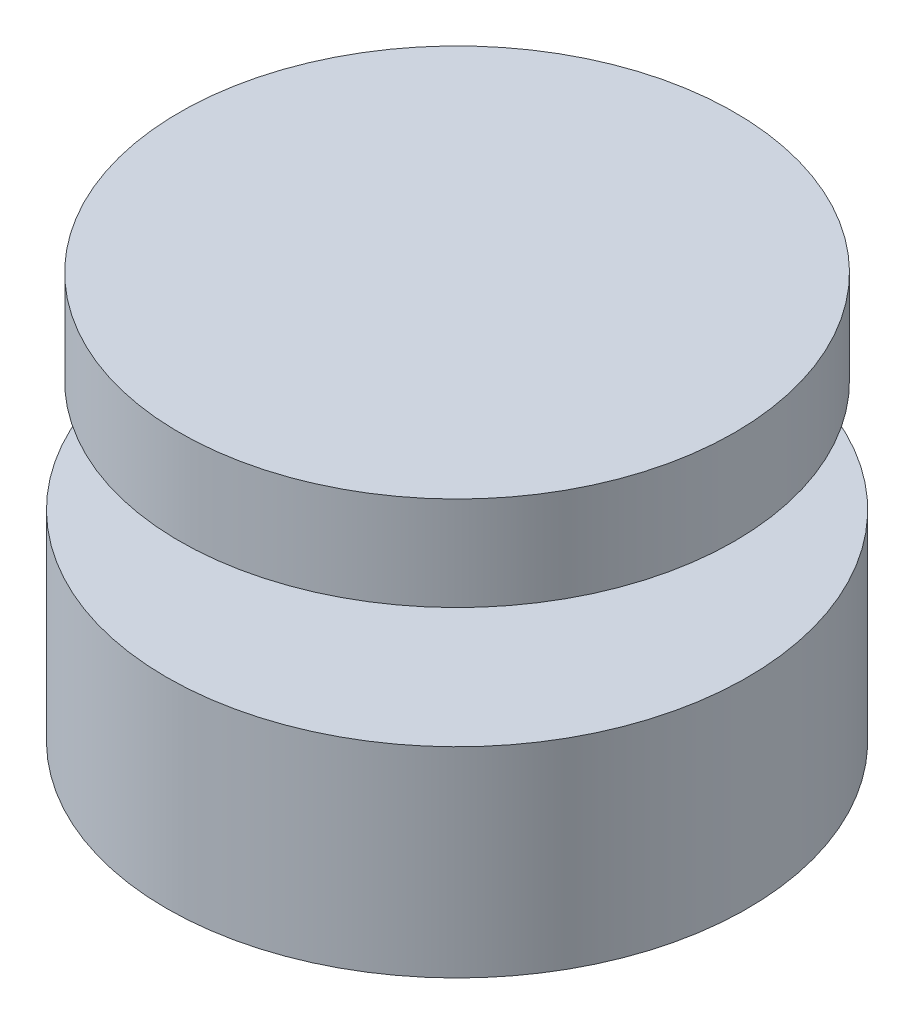
ISO-10303-21;
HEADER;
FILE_DESCRIPTION(('STEP AP214'),'2;1');
FILE_NAME('part.step','',(''),(''),'','','');
FILE_SCHEMA(('AUTOMOTIVE_DESIGN { 1 0 10303 214 1 1 1 1 }'));
ENDSEC;
DATA;
#1=APPLICATION_CONTEXT('core data for automotive mechanical design processes');
#2=APPLICATION_PROTOCOL_DEFINITION('international standard','automotive_design',2000,#1);
#3=PRODUCT_CONTEXT('',#1,'mechanical');
#4=PRODUCT('Part','Part','',(#3));
#5=PRODUCT_RELATED_PRODUCT_CATEGORY('part','',(#4));
#6=PRODUCT_DEFINITION_FORMATION('','',#4);
#7=PRODUCT_DEFINITION_CONTEXT('part definition',#1,'design');
#8=PRODUCT_DEFINITION('design','',#6,#7);
#9=PRODUCT_DEFINITION_SHAPE('','',#8);
#10=(LENGTH_UNIT() NAMED_UNIT(*) SI_UNIT(.MILLI.,.METRE.));
#11=(NAMED_UNIT(*) PLANE_ANGLE_UNIT() SI_UNIT($,.RADIAN.));
#12=(NAMED_UNIT(*) SI_UNIT($,.STERADIAN.) SOLID_ANGLE_UNIT());
#13=UNCERTAINTY_MEASURE_WITH_UNIT(LENGTH_MEASURE(1.E-05),#10,'distance_accuracy_value','');
#14=(GEOMETRIC_REPRESENTATION_CONTEXT(3) GLOBAL_UNCERTAINTY_ASSIGNED_CONTEXT((#13)) GLOBAL_UNIT_ASSIGNED_CONTEXT((#10,
#11,#12)) REPRESENTATION_CONTEXT('',''));
#15=CARTESIAN_POINT('',(0.,0.,0.));
#16=DIRECTION('',(0.,0.,1.));
#17=DIRECTION('',(1.,0.,0.));
#18=AXIS2_PLACEMENT_3D('',#15,#16,#17);
#19=CARTESIAN_POINT('',(0.,2.,0.));
#20=DIRECTION('',(0.,-1.,0.));
#21=DIRECTION('',(0.,0.,-1.));
#22=AXIS2_PLACEMENT_3D('',#19,#20,#21);
#23=CYLINDRICAL_SURFACE('',#22,2.9);
#24=CARTESIAN_POINT('',(0.,2.,0.));
#25=DIRECTION('',(0.,1.,0.));
#26=DIRECTION('',(0.,0.,1.));
#27=AXIS2_PLACEMENT_3D('',#24,#25,#26);
#28=CIRCLE('',#27,2.9);
#29=CARTESIAN_POINT('',(0.,2.,2.9));
#30=VERTEX_POINT('',#29);
#31=EDGE_CURVE('E10',#30,#30,#28,.T.);
#32=ORIENTED_EDGE('',*,*,#31,.F.);
#33=EDGE_LOOP('',(#32));
#34=FACE_BOUND('',#33,.T.);
#35=CARTESIAN_POINT('',(0.,0.,0.));
#36=DIRECTION('',(0.,1.,0.));
#37=DIRECTION('',(0.,0.,1.));
#38=AXIS2_PLACEMENT_3D('',#35,#36,#37);
#39=CIRCLE('',#38,2.9);
#40=CARTESIAN_POINT('',(0.,0.,2.9));
#41=VERTEX_POINT('',#40);
#42=EDGE_CURVE('E46',#41,#41,#39,.T.);
#43=ORIENTED_EDGE('',*,*,#42,.T.);
#44=EDGE_LOOP('',(#43));
#45=FACE_BOUND('',#44,.T.);
#46=ADVANCED_FACE('F43',(#34,#45),#23,.T.);
#47=CARTESIAN_POINT('',(0.,2.,0.));
#48=DIRECTION('',(0.,1.,0.));
#49=DIRECTION('',(0.,0.,1.));
#50=AXIS2_PLACEMENT_3D('',#47,#48,#49);
#51=PLANE('',#50);
#52=CARTESIAN_POINT('',(0.,2.,0.));
#53=DIRECTION('',(0.,-1.,0.));
#54=DIRECTION('',(1.,0.,0.));
#55=AXIS2_PLACEMENT_3D('',#52,#53,#54);
#56=CIRCLE('',#55,0.547366302761986);
#57=CARTESIAN_POINT('',(0.547366302761986,2.,0.));
#58=VERTEX_POINT('',#57);
#59=EDGE_CURVE('E64',#58,#58,#56,.T.);
#60=ORIENTED_EDGE('',*,*,#59,.T.);
#61=EDGE_LOOP('',(#60));
#62=FACE_BOUND('',#61,.T.);
#63=ORIENTED_EDGE('',*,*,#31,.T.);
#64=EDGE_LOOP('',(#63));
#65=FACE_BOUND('',#64,.T.);
#66=ADVANCED_FACE('F91',(#62,#65),#51,.T.);
#67=CARTESIAN_POINT('',(0.,0.,0.));
#68=DIRECTION('',(0.,1.,0.));
#69=DIRECTION('',(0.,0.,1.));
#70=AXIS2_PLACEMENT_3D('',#67,#68,#69);
#71=PLANE('',#70);
#72=CARTESIAN_POINT('',(0.,0.,0.));
#73=DIRECTION('',(0.,-1.,0.));
#74=DIRECTION('',(0.,0.,-1.));
#75=AXIS2_PLACEMENT_3D('',#72,#73,#74);
#76=CIRCLE('',#75,2.);
#77=CARTESIAN_POINT('',(0.,0.,-2.));
#78=VERTEX_POINT('',#77);
#79=EDGE_CURVE('E60',#78,#78,#76,.T.);
#80=ORIENTED_EDGE('',*,*,#79,.F.);
#81=EDGE_LOOP('',(#80));
#82=FACE_BOUND('',#81,.T.);
#83=ORIENTED_EDGE('',*,*,#42,.F.);
#84=EDGE_LOOP('',(#83));
#85=FACE_BOUND('',#84,.T.);
#86=ADVANCED_FACE('F97',(#82,#85),#71,.F.);
#87=CARTESIAN_POINT('',(0.,1.,0.));
#88=DIRECTION('',(0.,-1.,0.));
#89=DIRECTION('',(0.,0.,-1.));
#90=AXIS2_PLACEMENT_3D('',#87,#88,#89);
#91=CYLINDRICAL_SURFACE('',#90,2.);
#92=CARTESIAN_POINT('',(0.,1.,0.));
#93=DIRECTION('',(0.,-1.,0.));
#94=DIRECTION('',(0.,0.,-1.));
#95=AXIS2_PLACEMENT_3D('',#92,#93,#94);
#96=CIRCLE('',#95,2.);
#97=CARTESIAN_POINT('',(0.,1.,-2.));
#98=VERTEX_POINT('',#97);
#99=EDGE_CURVE('E54',#98,#98,#96,.T.);
#100=ORIENTED_EDGE('',*,*,#99,.F.);
#101=EDGE_LOOP('',(#100));
#102=FACE_BOUND('',#101,.T.);
#103=ORIENTED_EDGE('',*,*,#79,.T.);
#104=EDGE_LOOP('',(#103));
#105=FACE_BOUND('',#104,.T.);
#106=ADVANCED_FACE('F104',(#102,#105),#91,.F.);
#107=CARTESIAN_POINT('',(0.,1.,0.));
#108=DIRECTION('',(0.,-1.,0.));
#109=DIRECTION('',(0.,0.,-1.));
#110=AXIS2_PLACEMENT_3D('',#107,#108,#109);
#111=PLANE('',#110);
#112=ORIENTED_EDGE('',*,*,#99,.T.);
#113=EDGE_LOOP('',(#112));
#114=FACE_BOUND('',#113,.T.);
#115=ADVANCED_FACE('F109',(#114),#111,.T.);
#116=CARTESIAN_POINT('',(0.,2.,0.));
#117=DIRECTION('',(0.,-1.,0.));
#118=DIRECTION('',(1.,0.,0.));
#119=AXIS2_PLACEMENT_3D('',#116,#117,#118);
#120=CYLINDRICAL_SURFACE('',#119,0.547366302761986);
#121=ORIENTED_EDGE('',*,*,#59,.F.);
#122=EDGE_LOOP('',(#121));
#123=FACE_BOUND('',#122,.T.);
#124=CARTESIAN_POINT('',(0.,3.11295338841876,0.));
#125=DIRECTION('',(0.,-1.,0.));
#126=DIRECTION('',(1.,0.,0.));
#127=AXIS2_PLACEMENT_3D('',#124,#125,#126);
#128=CIRCLE('',#127,0.547366302761986);
#129=CARTESIAN_POINT('',(0.547366302761986,3.11295338841876,0.));
#130=VERTEX_POINT('',#129);
#131=EDGE_CURVE('E70',#130,#130,#128,.T.);
#132=ORIENTED_EDGE('',*,*,#131,.T.);
#133=EDGE_LOOP('',(#132));
#134=FACE_BOUND('',#133,.T.);
#135=ADVANCED_FACE('F116',(#123,#134),#120,.T.);
#136=CARTESIAN_POINT('',(-2.77136567621966,3.11295338841876,0.));
#137=DIRECTION('',(0.,1.,0.));
#138=DIRECTION('',(-1.,0.,0.));
#139=AXIS2_PLACEMENT_3D('',#136,#137,#138);
#140=PLANE('',#139);
#141=ORIENTED_EDGE('',*,*,#131,.F.);
#142=EDGE_LOOP('',(#141));
#143=FACE_BOUND('',#142,.T.);
#144=CARTESIAN_POINT('',(0.,3.11295338841876,0.));
#145=DIRECTION('',(0.,-1.,0.));
#146=DIRECTION('',(1.,0.,0.));
#147=AXIS2_PLACEMENT_3D('',#144,#145,#146);
#148=CIRCLE('',#147,2.77136567621966);
#149=CARTESIAN_POINT('',(2.77136567621966,3.11295338841876,0.));
#150=VERTEX_POINT('',#149);
#151=EDGE_CURVE('E75',#150,#150,#148,.T.);
#152=ORIENTED_EDGE('',*,*,#151,.T.);
#153=EDGE_LOOP('',(#152));
#154=FACE_BOUND('',#153,.T.);
#155=ADVANCED_FACE('F90',(#143,#154),#140,.F.);
#156=CARTESIAN_POINT('',(0.,2.,0.));
#157=DIRECTION('',(0.,-1.,0.));
#158=DIRECTION('',(1.,0.,0.));
#159=AXIS2_PLACEMENT_3D('',#156,#157,#158);
#160=CYLINDRICAL_SURFACE('',#159,2.77136567621966);
#161=ORIENTED_EDGE('',*,*,#151,.F.);
#162=EDGE_LOOP('',(#161));
#163=FACE_BOUND('',#162,.T.);
#164=CARTESIAN_POINT('',(0.,4.05174085260399,0.));
#165=DIRECTION('',(0.,-1.,0.));
#166=DIRECTION('',(1.,0.,0.));
#167=AXIS2_PLACEMENT_3D('',#164,#165,#166);
#168=CIRCLE('',#167,2.77136567621966);
#169=CARTESIAN_POINT('',(2.77136567621966,4.05174085260399,0.));
#170=VERTEX_POINT('',#169);
#171=EDGE_CURVE('E79',#170,#170,#168,.T.);
#172=ORIENTED_EDGE('',*,*,#171,.T.);
#173=EDGE_LOOP('',(#172));
#174=FACE_BOUND('',#173,.T.);
#175=ADVANCED_FACE('F84',(#163,#174),#160,.T.);
#176=CARTESIAN_POINT('',(-2.77136567621966,4.05174085260399,0.));
#177=DIRECTION('',(0.,-1.,0.));
#178=DIRECTION('',(1.,0.,0.));
#179=AXIS2_PLACEMENT_3D('',#176,#177,#178);
#180=PLANE('',#179);
#181=ORIENTED_EDGE('',*,*,#171,.F.);
#182=EDGE_LOOP('',(#181));
#183=FACE_BOUND('',#182,.T.);
#184=ADVANCED_FACE('F85',(#183),#180,.F.);
#185=CLOSED_SHELL('',(#46,#66,#86,#106,#115,#135,#155,#175,#184));
#186=MANIFOLD_SOLID_BREP('B2',#185);
#187=ADVANCED_BREP_SHAPE_REPRESENTATION('',(#18,#186),#14);
#188=SHAPE_DEFINITION_REPRESENTATION(#9,#187);
ENDSEC;
END-ISO-10303-21;
